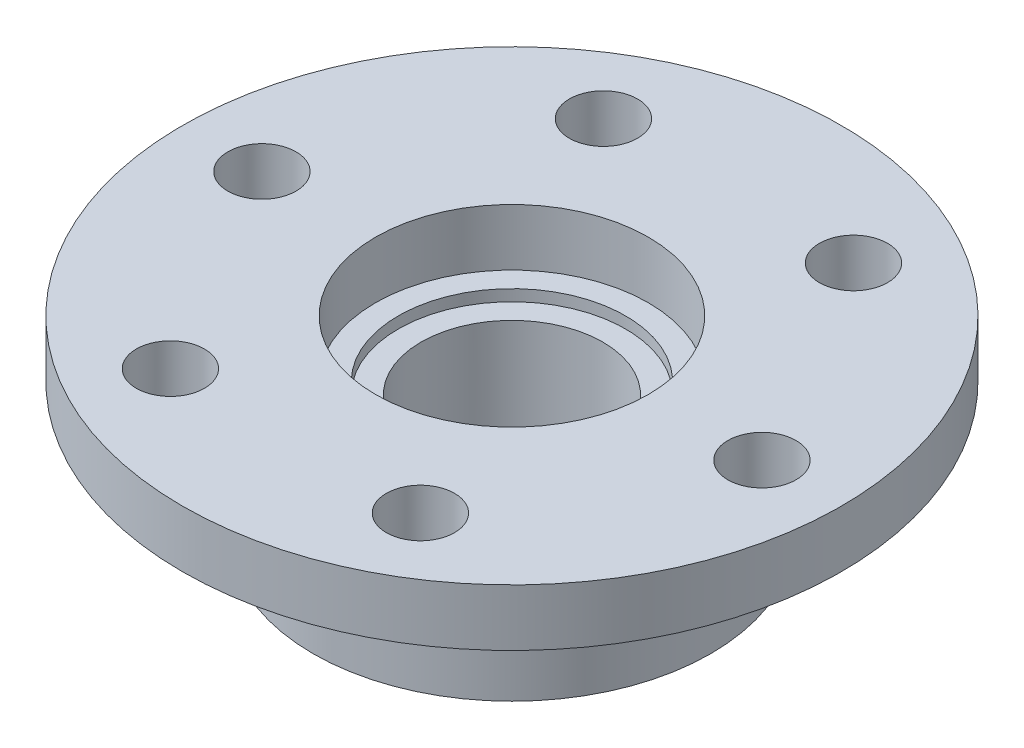
ISO-10303-21;
HEADER;
FILE_DESCRIPTION(('STEP AP214'),'2;1');
FILE_NAME('part.step','',(''),(''),'','','');
FILE_SCHEMA(('AUTOMOTIVE_DESIGN { 1 0 10303 214 1 1 1 1 }'));
ENDSEC;
DATA;
#1=APPLICATION_CONTEXT('core data for automotive mechanical design processes');
#2=APPLICATION_PROTOCOL_DEFINITION('international standard','automotive_design',2000,#1);
#3=PRODUCT_CONTEXT('',#1,'mechanical');
#4=PRODUCT('Part','Part','',(#3));
#5=PRODUCT_RELATED_PRODUCT_CATEGORY('part','',(#4));
#6=PRODUCT_DEFINITION_FORMATION('','',#4);
#7=PRODUCT_DEFINITION_CONTEXT('part definition',#1,'design');
#8=PRODUCT_DEFINITION('design','',#6,#7);
#9=PRODUCT_DEFINITION_SHAPE('','',#8);
#10=(LENGTH_UNIT() NAMED_UNIT(*) SI_UNIT(.MILLI.,.METRE.));
#11=(NAMED_UNIT(*) PLANE_ANGLE_UNIT() SI_UNIT($,.RADIAN.));
#12=(NAMED_UNIT(*) SI_UNIT($,.STERADIAN.) SOLID_ANGLE_UNIT());
#13=UNCERTAINTY_MEASURE_WITH_UNIT(LENGTH_MEASURE(1.E-05),#10,'distance_accuracy_value','');
#14=(GEOMETRIC_REPRESENTATION_CONTEXT(3) GLOBAL_UNCERTAINTY_ASSIGNED_CONTEXT((#13)) GLOBAL_UNIT_ASSIGNED_CONTEXT((#10,
#11,#12)) REPRESENTATION_CONTEXT('',''));
#15=CARTESIAN_POINT('',(0.,0.,0.));
#16=DIRECTION('',(0.,0.,1.));
#17=DIRECTION('',(1.,0.,0.));
#18=AXIS2_PLACEMENT_3D('',#15,#16,#17);
#19=CARTESIAN_POINT('',(0.,12.,0.));
#20=DIRECTION('',(0.,1.,0.));
#21=DIRECTION('',(0.,0.,1.));
#22=AXIS2_PLACEMENT_3D('',#19,#20,#21);
#23=PLANE('',#22);
#24=CARTESIAN_POINT('',(0.,12.,0.));
#25=DIRECTION('',(0.,1.,0.));
#26=DIRECTION('',(0.,0.,1.));
#27=AXIS2_PLACEMENT_3D('',#24,#25,#26);
#28=CIRCLE('',#27,29.);
#29=CARTESIAN_POINT('',(0.,12.,29.));
#30=VERTEX_POINT('',#29);
#31=EDGE_CURVE('E49',#30,#30,#28,.T.);
#32=ORIENTED_EDGE('',*,*,#31,.F.);
#33=EDGE_LOOP('',(#32));
#34=FACE_BOUND('',#33,.T.);
#35=CARTESIAN_POINT('',(11.,12.,-19.0525588832576));
#36=DIRECTION('',(0.,-1.,0.));
#37=DIRECTION('',(0.,0.,-1.));
#38=AXIS2_PLACEMENT_3D('',#35,#36,#37);
#39=CIRCLE('',#38,3.);
#40=CARTESIAN_POINT('',(11.,12.,-22.0525588832576));
#41=VERTEX_POINT('',#40);
#42=EDGE_CURVE('E89',#41,#41,#39,.T.);
#43=ORIENTED_EDGE('',*,*,#42,.F.);
#44=EDGE_LOOP('',(#43));
#45=FACE_BOUND('',#44,.T.);
#46=CARTESIAN_POINT('',(-11.,12.,-19.0525588832577));
#47=DIRECTION('',(0.,-1.,0.));
#48=DIRECTION('',(0.,0.,-1.));
#49=AXIS2_PLACEMENT_3D('',#46,#47,#48);
#50=CIRCLE('',#49,3.);
#51=CARTESIAN_POINT('',(-11.,12.,-22.0525588832576));
#52=VERTEX_POINT('',#51);
#53=EDGE_CURVE('E83',#52,#52,#50,.T.);
#54=ORIENTED_EDGE('',*,*,#53,.F.);
#55=EDGE_LOOP('',(#54));
#56=FACE_BOUND('',#55,.T.);
#57=CARTESIAN_POINT('',(-22.,12.,0.));
#58=DIRECTION('',(0.,-1.,0.));
#59=DIRECTION('',(0.,0.,-1.));
#60=AXIS2_PLACEMENT_3D('',#57,#58,#59);
#61=CIRCLE('',#60,3.);
#62=CARTESIAN_POINT('',(-22.,12.,-3.));
#63=VERTEX_POINT('',#62);
#64=EDGE_CURVE('E77',#63,#63,#61,.T.);
#65=ORIENTED_EDGE('',*,*,#64,.F.);
#66=EDGE_LOOP('',(#65));
#67=FACE_BOUND('',#66,.T.);
#68=CARTESIAN_POINT('',(-11.,12.,19.0525588832576));
#69=DIRECTION('',(0.,-1.,0.));
#70=DIRECTION('',(0.,0.,-1.));
#71=AXIS2_PLACEMENT_3D('',#68,#69,#70);
#72=CIRCLE('',#71,3.);
#73=CARTESIAN_POINT('',(-11.,12.,16.0525588832576));
#74=VERTEX_POINT('',#73);
#75=EDGE_CURVE('E70',#74,#74,#72,.T.);
#76=ORIENTED_EDGE('',*,*,#75,.F.);
#77=EDGE_LOOP('',(#76));
#78=FACE_BOUND('',#77,.T.);
#79=CARTESIAN_POINT('',(11.,12.,19.0525588832577));
#80=DIRECTION('',(0.,-1.,0.));
#81=DIRECTION('',(0.,0.,-1.));
#82=AXIS2_PLACEMENT_3D('',#79,#80,#81);
#83=CIRCLE('',#82,3.);
#84=CARTESIAN_POINT('',(11.,12.,16.0525588832577));
#85=VERTEX_POINT('',#84);
#86=EDGE_CURVE('E71',#85,#85,#83,.T.);
#87=ORIENTED_EDGE('',*,*,#86,.F.);
#88=EDGE_LOOP('',(#87));
#89=FACE_BOUND('',#88,.T.);
#90=CARTESIAN_POINT('',(22.,12.,0.));
#91=DIRECTION('',(0.,-1.,0.));
#92=DIRECTION('',(0.,0.,-1.));
#93=AXIS2_PLACEMENT_3D('',#90,#91,#92);
#94=CIRCLE('',#93,2.99999999999999);
#95=CARTESIAN_POINT('',(22.,12.,-2.99999999999999));
#96=VERTEX_POINT('',#95);
#97=EDGE_CURVE('E64',#96,#96,#94,.T.);
#98=ORIENTED_EDGE('',*,*,#97,.F.);
#99=EDGE_LOOP('',(#98));
#100=FACE_BOUND('',#99,.T.);
#101=CARTESIAN_POINT('',(0.,12.,0.));
#102=DIRECTION('',(0.,1.,0.));
#103=DIRECTION('',(0.,0.,1.));
#104=AXIS2_PLACEMENT_3D('',#101,#102,#103);
#105=CIRCLE('',#104,18.8);
#106=CARTESIAN_POINT('',(0.,12.,18.8));
#107=VERTEX_POINT('',#106);
#108=EDGE_CURVE('E10',#107,#107,#105,.F.);
#109=ORIENTED_EDGE('',*,*,#108,.F.);
#110=EDGE_LOOP('',(#109));
#111=FACE_BOUND('',#110,.T.);
#112=ADVANCED_FACE('F34',(#34,#45,#56,#67,#78,#89,#100,#111),#23,.F.);
#113=CARTESIAN_POINT('',(0.,17.,0.));
#114=DIRECTION('',(0.,-1.,0.));
#115=DIRECTION('',(0.,0.,-1.));
#116=AXIS2_PLACEMENT_3D('',#113,#114,#115);
#117=CYLINDRICAL_SURFACE('',#116,29.);
#118=CARTESIAN_POINT('',(0.,17.,0.));
#119=DIRECTION('',(0.,1.,0.));
#120=DIRECTION('',(0.,0.,1.));
#121=AXIS2_PLACEMENT_3D('',#118,#119,#120);
#122=CIRCLE('',#121,29.);
#123=CARTESIAN_POINT('',(0.,17.,29.));
#124=VERTEX_POINT('',#123);
#125=EDGE_CURVE('E45',#124,#124,#122,.T.);
#126=ORIENTED_EDGE('',*,*,#125,.F.);
#127=EDGE_LOOP('',(#126));
#128=FACE_BOUND('',#127,.T.);
#129=ORIENTED_EDGE('',*,*,#31,.T.);
#130=EDGE_LOOP('',(#129));
#131=FACE_BOUND('',#130,.T.);
#132=ADVANCED_FACE('F194',(#128,#131),#117,.T.);
#133=CARTESIAN_POINT('',(0.,17.,0.));
#134=DIRECTION('',(0.,1.,0.));
#135=DIRECTION('',(0.,0.,1.));
#136=AXIS2_PLACEMENT_3D('',#133,#134,#135);
#137=PLANE('',#136);
#138=CARTESIAN_POINT('',(22.,17.,0.));
#139=DIRECTION('',(0.,1.,0.));
#140=DIRECTION('',(0.,0.,1.));
#141=AXIS2_PLACEMENT_3D('',#138,#139,#140);
#142=CIRCLE('',#141,2.99999999999999);
#143=CARTESIAN_POINT('',(22.,17.,2.99999999999999));
#144=VERTEX_POINT('',#143);
#145=EDGE_CURVE('E92',#144,#144,#142,.F.);
#146=ORIENTED_EDGE('',*,*,#145,.T.);
#147=EDGE_LOOP('',(#146));
#148=FACE_BOUND('',#147,.T.);
#149=CARTESIAN_POINT('',(11.,17.,19.0525588832577));
#150=DIRECTION('',(0.,1.,0.));
#151=DIRECTION('',(0.,0.,1.));
#152=AXIS2_PLACEMENT_3D('',#149,#150,#151);
#153=CIRCLE('',#152,3.);
#154=CARTESIAN_POINT('',(11.,17.,22.0525588832577));
#155=VERTEX_POINT('',#154);
#156=EDGE_CURVE('E93',#155,#155,#153,.F.);
#157=ORIENTED_EDGE('',*,*,#156,.T.);
#158=EDGE_LOOP('',(#157));
#159=FACE_BOUND('',#158,.T.);
#160=CARTESIAN_POINT('',(-11.,17.,19.0525588832576));
#161=DIRECTION('',(0.,1.,0.));
#162=DIRECTION('',(0.,0.,1.));
#163=AXIS2_PLACEMENT_3D('',#160,#161,#162);
#164=CIRCLE('',#163,3.);
#165=CARTESIAN_POINT('',(-11.,17.,22.0525588832576));
#166=VERTEX_POINT('',#165);
#167=EDGE_CURVE('E67',#166,#166,#164,.F.);
#168=ORIENTED_EDGE('',*,*,#167,.T.);
#169=EDGE_LOOP('',(#168));
#170=FACE_BOUND('',#169,.T.);
#171=CARTESIAN_POINT('',(-22.,17.,0.));
#172=DIRECTION('',(0.,1.,0.));
#173=DIRECTION('',(0.,0.,1.));
#174=AXIS2_PLACEMENT_3D('',#171,#172,#173);
#175=CIRCLE('',#174,3.);
#176=CARTESIAN_POINT('',(-22.,17.,3.));
#177=VERTEX_POINT('',#176);
#178=EDGE_CURVE('E74',#177,#177,#175,.F.);
#179=ORIENTED_EDGE('',*,*,#178,.T.);
#180=EDGE_LOOP('',(#179));
#181=FACE_BOUND('',#180,.T.);
#182=CARTESIAN_POINT('',(-11.,17.,-19.0525588832577));
#183=DIRECTION('',(0.,1.,0.));
#184=DIRECTION('',(0.,0.,1.));
#185=AXIS2_PLACEMENT_3D('',#182,#183,#184);
#186=CIRCLE('',#185,3.);
#187=CARTESIAN_POINT('',(-11.,17.,-16.0525588832577));
#188=VERTEX_POINT('',#187);
#189=EDGE_CURVE('E80',#188,#188,#186,.F.);
#190=ORIENTED_EDGE('',*,*,#189,.T.);
#191=EDGE_LOOP('',(#190));
#192=FACE_BOUND('',#191,.T.);
#193=CARTESIAN_POINT('',(11.,17.,-19.0525588832576));
#194=DIRECTION('',(0.,1.,0.));
#195=DIRECTION('',(0.,0.,1.));
#196=AXIS2_PLACEMENT_3D('',#193,#194,#195);
#197=CIRCLE('',#196,3.);
#198=CARTESIAN_POINT('',(11.,17.,-16.0525588832576));
#199=VERTEX_POINT('',#198);
#200=EDGE_CURVE('E86',#199,#199,#197,.F.);
#201=ORIENTED_EDGE('',*,*,#200,.T.);
#202=EDGE_LOOP('',(#201));
#203=FACE_BOUND('',#202,.T.);
#204=CARTESIAN_POINT('',(0.,17.,0.));
#205=DIRECTION('',(0.,1.,0.));
#206=DIRECTION('',(0.,0.,1.));
#207=AXIS2_PLACEMENT_3D('',#204,#205,#206);
#208=CIRCLE('',#207,12.);
#209=CARTESIAN_POINT('',(0.,17.,12.));
#210=VERTEX_POINT('',#209);
#211=EDGE_CURVE('E55',#210,#210,#208,.T.);
#212=ORIENTED_EDGE('',*,*,#211,.F.);
#213=EDGE_LOOP('',(#212));
#214=FACE_BOUND('',#213,.T.);
#215=ORIENTED_EDGE('',*,*,#125,.T.);
#216=EDGE_LOOP('',(#215));
#217=FACE_BOUND('',#216,.T.);
#218=ADVANCED_FACE('F200',(#148,#159,#170,#181,#192,#203,#214,#217),#137,.T.);
#219=CARTESIAN_POINT('',(0.,12.,0.));
#220=DIRECTION('',(0.,1.,0.));
#221=DIRECTION('',(0.,0.,1.));
#222=AXIS2_PLACEMENT_3D('',#219,#220,#221);
#223=CYLINDRICAL_SURFACE('',#222,12.);
#224=CARTESIAN_POINT('',(0.,12.,0.));
#225=DIRECTION('',(0.,1.,0.));
#226=DIRECTION('',(0.,0.,1.));
#227=AXIS2_PLACEMENT_3D('',#224,#225,#226);
#228=CIRCLE('',#227,12.);
#229=CARTESIAN_POINT('',(0.,12.,12.));
#230=VERTEX_POINT('',#229);
#231=EDGE_CURVE('E53',#230,#230,#228,.T.);
#232=ORIENTED_EDGE('',*,*,#231,.F.);
#233=EDGE_LOOP('',(#232));
#234=FACE_BOUND('',#233,.T.);
#235=ORIENTED_EDGE('',*,*,#211,.T.);
#236=EDGE_LOOP('',(#235));
#237=FACE_BOUND('',#236,.T.);
#238=ADVANCED_FACE('F208',(#234,#237),#223,.F.);
#239=CARTESIAN_POINT('',(0.,12.,0.));
#240=DIRECTION('',(0.,1.,0.));
#241=DIRECTION('',(0.,0.,1.));
#242=AXIS2_PLACEMENT_3D('',#239,#240,#241);
#243=PLANE('',#242);
#244=CARTESIAN_POINT('',(0.,12.,0.));
#245=DIRECTION('',(0.,1.,0.));
#246=DIRECTION('',(0.,0.,1.));
#247=AXIS2_PLACEMENT_3D('',#244,#245,#246);
#248=CIRCLE('',#247,10.);
#249=CARTESIAN_POINT('',(0.,12.,10.));
#250=VERTEX_POINT('',#249);
#251=EDGE_CURVE('E61',#250,#250,#248,.T.);
#252=ORIENTED_EDGE('',*,*,#251,.F.);
#253=EDGE_LOOP('',(#252));
#254=FACE_BOUND('',#253,.T.);
#255=ORIENTED_EDGE('',*,*,#231,.T.);
#256=EDGE_LOOP('',(#255));
#257=FACE_BOUND('',#256,.T.);
#258=ADVANCED_FACE('F212',(#254,#257),#243,.T.);
#259=CARTESIAN_POINT('',(0.,11.,0.));
#260=DIRECTION('',(0.,1.,0.));
#261=DIRECTION('',(0.,0.,1.));
#262=AXIS2_PLACEMENT_3D('',#259,#260,#261);
#263=CYLINDRICAL_SURFACE('',#262,10.);
#264=CARTESIAN_POINT('',(0.,11.,0.));
#265=DIRECTION('',(0.,1.,0.));
#266=DIRECTION('',(0.,0.,1.));
#267=AXIS2_PLACEMENT_3D('',#264,#265,#266);
#268=CIRCLE('',#267,10.);
#269=CARTESIAN_POINT('',(0.,11.,10.));
#270=VERTEX_POINT('',#269);
#271=EDGE_CURVE('E58',#270,#270,#268,.T.);
#272=ORIENTED_EDGE('',*,*,#271,.F.);
#273=EDGE_LOOP('',(#272));
#274=FACE_BOUND('',#273,.T.);
#275=ORIENTED_EDGE('',*,*,#251,.T.);
#276=EDGE_LOOP('',(#275));
#277=FACE_BOUND('',#276,.T.);
#278=ADVANCED_FACE('F216',(#274,#277),#263,.F.);
#279=CARTESIAN_POINT('',(0.,11.,0.));
#280=DIRECTION('',(0.,1.,0.));
#281=DIRECTION('',(0.,0.,1.));
#282=AXIS2_PLACEMENT_3D('',#279,#280,#281);
#283=PLANE('',#282);
#284=CARTESIAN_POINT('',(0.,11.,0.));
#285=DIRECTION('',(0.,1.,0.));
#286=DIRECTION('',(0.,0.,1.));
#287=AXIS2_PLACEMENT_3D('',#284,#285,#286);
#288=CIRCLE('',#287,8.);
#289=CARTESIAN_POINT('',(0.,11.,8.));
#290=VERTEX_POINT('',#289);
#291=EDGE_CURVE('E109',#290,#290,#288,.F.);
#292=ORIENTED_EDGE('',*,*,#291,.T.);
#293=EDGE_LOOP('',(#292));
#294=FACE_BOUND('',#293,.T.);
#295=ORIENTED_EDGE('',*,*,#271,.T.);
#296=EDGE_LOOP('',(#295));
#297=FACE_BOUND('',#296,.T.);
#298=ADVANCED_FACE('F220',(#294,#297),#283,.T.);
#299=CARTESIAN_POINT('',(11.,17.001,-19.0525588832576));
#300=DIRECTION('',(0.,-1.,0.));
#301=DIRECTION('',(0.,0.,-1.));
#302=AXIS2_PLACEMENT_3D('',#299,#300,#301);
#303=CYLINDRICAL_SURFACE('',#302,3.);
#304=ORIENTED_EDGE('',*,*,#200,.F.);
#305=EDGE_LOOP('',(#304));
#306=FACE_BOUND('',#305,.T.);
#307=ORIENTED_EDGE('',*,*,#42,.T.);
#308=EDGE_LOOP('',(#307));
#309=FACE_BOUND('',#308,.T.);
#310=ADVANCED_FACE('F224',(#306,#309),#303,.F.);
#311=CARTESIAN_POINT('',(-11.,17.001,-19.0525588832577));
#312=DIRECTION('',(0.,-1.,0.));
#313=DIRECTION('',(0.,0.,-1.));
#314=AXIS2_PLACEMENT_3D('',#311,#312,#313);
#315=CYLINDRICAL_SURFACE('',#314,3.);
#316=ORIENTED_EDGE('',*,*,#189,.F.);
#317=EDGE_LOOP('',(#316));
#318=FACE_BOUND('',#317,.T.);
#319=ORIENTED_EDGE('',*,*,#53,.T.);
#320=EDGE_LOOP('',(#319));
#321=FACE_BOUND('',#320,.T.);
#322=ADVANCED_FACE('F234',(#318,#321),#315,.F.);
#323=CARTESIAN_POINT('',(-22.,17.001,0.));
#324=DIRECTION('',(0.,-1.,0.));
#325=DIRECTION('',(0.,0.,-1.));
#326=AXIS2_PLACEMENT_3D('',#323,#324,#325);
#327=CYLINDRICAL_SURFACE('',#326,3.);
#328=ORIENTED_EDGE('',*,*,#178,.F.);
#329=EDGE_LOOP('',(#328));
#330=FACE_BOUND('',#329,.T.);
#331=ORIENTED_EDGE('',*,*,#64,.T.);
#332=EDGE_LOOP('',(#331));
#333=FACE_BOUND('',#332,.T.);
#334=ADVANCED_FACE('F230',(#330,#333),#327,.F.);
#335=CARTESIAN_POINT('',(-11.,17.001,19.0525588832576));
#336=DIRECTION('',(0.,-1.,0.));
#337=DIRECTION('',(0.,0.,-1.));
#338=AXIS2_PLACEMENT_3D('',#335,#336,#337);
#339=CYLINDRICAL_SURFACE('',#338,3.);
#340=ORIENTED_EDGE('',*,*,#167,.F.);
#341=EDGE_LOOP('',(#340));
#342=FACE_BOUND('',#341,.T.);
#343=ORIENTED_EDGE('',*,*,#75,.T.);
#344=EDGE_LOOP('',(#343));
#345=FACE_BOUND('',#344,.T.);
#346=ADVANCED_FACE('F226',(#342,#345),#339,.F.);
#347=CARTESIAN_POINT('',(11.,17.001,19.0525588832577));
#348=DIRECTION('',(0.,-1.,0.));
#349=DIRECTION('',(0.,0.,-1.));
#350=AXIS2_PLACEMENT_3D('',#347,#348,#349);
#351=CYLINDRICAL_SURFACE('',#350,3.);
#352=ORIENTED_EDGE('',*,*,#156,.F.);
#353=EDGE_LOOP('',(#352));
#354=FACE_BOUND('',#353,.T.);
#355=ORIENTED_EDGE('',*,*,#86,.T.);
#356=EDGE_LOOP('',(#355));
#357=FACE_BOUND('',#356,.T.);
#358=ADVANCED_FACE('F229',(#354,#357),#351,.F.);
#359=CARTESIAN_POINT('',(22.,17.001,0.));
#360=DIRECTION('',(0.,-1.,0.));
#361=DIRECTION('',(0.,0.,-1.));
#362=AXIS2_PLACEMENT_3D('',#359,#360,#361);
#363=CYLINDRICAL_SURFACE('',#362,2.99999999999999);
#364=ORIENTED_EDGE('',*,*,#145,.F.);
#365=EDGE_LOOP('',(#364));
#366=FACE_BOUND('',#365,.T.);
#367=ORIENTED_EDGE('',*,*,#97,.T.);
#368=EDGE_LOOP('',(#367));
#369=FACE_BOUND('',#368,.T.);
#370=ADVANCED_FACE('F244',(#366,#369),#363,.F.);
#371=CARTESIAN_POINT('',(0.,11.1,0.));
#372=DIRECTION('',(0.,-1.,0.));
#373=DIRECTION('',(0.,0.,-1.));
#374=AXIS2_PLACEMENT_3D('',#371,#372,#373);
#375=PLANE('',#374);
#376=CARTESIAN_POINT('',(0.,11.1,0.));
#377=DIRECTION('',(0.,-1.,0.));
#378=DIRECTION('',(0.,0.,-1.));
#379=AXIS2_PLACEMENT_3D('',#376,#377,#378);
#380=CIRCLE('',#379,18.8);
#381=CARTESIAN_POINT('',(0.,11.1,-18.8));
#382=VERTEX_POINT('',#381);
#383=EDGE_CURVE('E96',#382,#382,#380,.T.);
#384=ORIENTED_EDGE('',*,*,#383,.T.);
#385=EDGE_LOOP('',(#384));
#386=FACE_BOUND('',#385,.T.);
#387=CARTESIAN_POINT('',(0.,11.1,0.));
#388=DIRECTION('',(0.,-1.,0.));
#389=DIRECTION('',(0.,0.,-1.));
#390=AXIS2_PLACEMENT_3D('',#387,#388,#389);
#391=CIRCLE('',#390,17.5);
#392=CARTESIAN_POINT('',(0.,11.1,-17.5));
#393=VERTEX_POINT('',#392);
#394=EDGE_CURVE('E105',#393,#393,#391,.T.);
#395=ORIENTED_EDGE('',*,*,#394,.F.);
#396=EDGE_LOOP('',(#395));
#397=FACE_BOUND('',#396,.T.);
#398=ADVANCED_FACE('F248',(#386,#397),#375,.T.);
#399=CARTESIAN_POINT('',(0.,11.1,0.));
#400=DIRECTION('',(0.,1.,0.));
#401=DIRECTION('',(0.,0.,1.));
#402=AXIS2_PLACEMENT_3D('',#399,#400,#401);
#403=CYLINDRICAL_SURFACE('',#402,18.8);
#404=ORIENTED_EDGE('',*,*,#383,.F.);
#405=EDGE_LOOP('',(#404));
#406=FACE_BOUND('',#405,.T.);
#407=ORIENTED_EDGE('',*,*,#108,.T.);
#408=EDGE_LOOP('',(#407));
#409=FACE_BOUND('',#408,.T.);
#410=ADVANCED_FACE('F163',(#406,#409),#403,.T.);
#411=CARTESIAN_POINT('',(0.,0.,0.));
#412=DIRECTION('',(0.,1.,0.));
#413=DIRECTION('',(0.,0.,1.));
#414=AXIS2_PLACEMENT_3D('',#411,#412,#413);
#415=PLANE('',#414);
#416=CARTESIAN_POINT('',(0.,0.,12.75));
#417=DIRECTION('',(0.,-1.,0.));
#418=DIRECTION('',(0.,0.,-1.));
#419=AXIS2_PLACEMENT_3D('',#416,#417,#418);
#420=CIRCLE('',#419,2.7);
#421=CARTESIAN_POINT('',(0.,0.,10.05));
#422=VERTEX_POINT('',#421);
#423=EDGE_CURVE('E140',#422,#422,#420,.T.);
#424=ORIENTED_EDGE('',*,*,#423,.F.);
#425=EDGE_LOOP('',(#424));
#426=FACE_BOUND('',#425,.T.);
#427=CARTESIAN_POINT('',(-11.0418238982516,0.,6.37499999999999));
#428=DIRECTION('',(0.,-1.,0.));
#429=DIRECTION('',(0.,0.,-1.));
#430=AXIS2_PLACEMENT_3D('',#427,#428,#429);
#431=CIRCLE('',#430,2.7);
#432=CARTESIAN_POINT('',(-11.0418238982516,0.,3.67499999999999));
#433=VERTEX_POINT('',#432);
#434=EDGE_CURVE('E141',#433,#433,#431,.T.);
#435=ORIENTED_EDGE('',*,*,#434,.F.);
#436=EDGE_LOOP('',(#435));
#437=FACE_BOUND('',#436,.T.);
#438=CARTESIAN_POINT('',(-11.0418238982516,0.,-6.37500000000001));
#439=DIRECTION('',(0.,-1.,0.));
#440=DIRECTION('',(0.,0.,-1.));
#441=AXIS2_PLACEMENT_3D('',#438,#439,#440);
#442=CIRCLE('',#441,2.7);
#443=CARTESIAN_POINT('',(-11.0418238982516,0.,-9.07500000000001));
#444=VERTEX_POINT('',#443);
#445=EDGE_CURVE('E115',#444,#444,#442,.T.);
#446=ORIENTED_EDGE('',*,*,#445,.F.);
#447=EDGE_LOOP('',(#446));
#448=FACE_BOUND('',#447,.T.);
#449=CARTESIAN_POINT('',(0.,0.,-12.75));
#450=DIRECTION('',(0.,-1.,0.));
#451=DIRECTION('',(0.,0.,-1.));
#452=AXIS2_PLACEMENT_3D('',#449,#450,#451);
#453=CIRCLE('',#452,2.7);
#454=CARTESIAN_POINT('',(0.,0.,-15.45));
#455=VERTEX_POINT('',#454);
#456=EDGE_CURVE('E122',#455,#455,#453,.T.);
#457=ORIENTED_EDGE('',*,*,#456,.F.);
#458=EDGE_LOOP('',(#457));
#459=FACE_BOUND('',#458,.T.);
#460=CARTESIAN_POINT('',(11.0418238982516,0.,-6.375));
#461=DIRECTION('',(0.,-1.,0.));
#462=DIRECTION('',(0.,0.,-1.));
#463=AXIS2_PLACEMENT_3D('',#460,#461,#462);
#464=CIRCLE('',#463,2.7);
#465=CARTESIAN_POINT('',(11.0418238982516,0.,-9.075));
#466=VERTEX_POINT('',#465);
#467=EDGE_CURVE('E128',#466,#466,#464,.T.);
#468=ORIENTED_EDGE('',*,*,#467,.F.);
#469=EDGE_LOOP('',(#468));
#470=FACE_BOUND('',#469,.T.);
#471=CARTESIAN_POINT('',(11.0418238982516,0.,6.375));
#472=DIRECTION('',(0.,-1.,0.));
#473=DIRECTION('',(0.,0.,-1.));
#474=AXIS2_PLACEMENT_3D('',#471,#472,#473);
#475=CIRCLE('',#474,2.7);
#476=CARTESIAN_POINT('',(11.0418238982516,0.,3.675));
#477=VERTEX_POINT('',#476);
#478=EDGE_CURVE('E134',#477,#477,#475,.T.);
#479=ORIENTED_EDGE('',*,*,#478,.F.);
#480=EDGE_LOOP('',(#479));
#481=FACE_BOUND('',#480,.T.);
#482=CARTESIAN_POINT('',(0.,0.,0.));
#483=DIRECTION('',(0.,-1.,0.));
#484=DIRECTION('',(0.,0.,-1.));
#485=AXIS2_PLACEMENT_3D('',#482,#483,#484);
#486=CIRCLE('',#485,8.);
#487=CARTESIAN_POINT('',(0.,0.,-8.));
#488=VERTEX_POINT('',#487);
#489=EDGE_CURVE('E108',#488,#488,#486,.T.);
#490=ORIENTED_EDGE('',*,*,#489,.F.);
#491=EDGE_LOOP('',(#490));
#492=FACE_BOUND('',#491,.T.);
#493=CARTESIAN_POINT('',(0.,0.,0.));
#494=DIRECTION('',(0.,1.,0.));
#495=DIRECTION('',(0.,0.,1.));
#496=AXIS2_PLACEMENT_3D('',#493,#494,#495);
#497=CIRCLE('',#496,17.5);
#498=CARTESIAN_POINT('',(0.,0.,17.5));
#499=VERTEX_POINT('',#498);
#500=EDGE_CURVE('E41',#499,#499,#497,.T.);
#501=ORIENTED_EDGE('',*,*,#500,.F.);
#502=EDGE_LOOP('',(#501));
#503=FACE_BOUND('',#502,.T.);
#504=ADVANCED_FACE('F160',(#426,#437,#448,#459,#470,#481,#492,#503),#415,.F.);
#505=CARTESIAN_POINT('',(0.,12.,0.));
#506=DIRECTION('',(0.,-1.,0.));
#507=DIRECTION('',(0.,0.,-1.));
#508=AXIS2_PLACEMENT_3D('',#505,#506,#507);
#509=CYLINDRICAL_SURFACE('',#508,17.5);
#510=ORIENTED_EDGE('',*,*,#394,.T.);
#511=EDGE_LOOP('',(#510));
#512=FACE_BOUND('',#511,.T.);
#513=ORIENTED_EDGE('',*,*,#500,.T.);
#514=EDGE_LOOP('',(#513));
#515=FACE_BOUND('',#514,.T.);
#516=ADVANCED_FACE('F36',(#512,#515),#509,.T.);
#517=CARTESIAN_POINT('',(0.,17.001,0.));
#518=DIRECTION('',(0.,-1.,0.));
#519=DIRECTION('',(0.,0.,-1.));
#520=AXIS2_PLACEMENT_3D('',#517,#518,#519);
#521=CYLINDRICAL_SURFACE('',#520,8.);
#522=ORIENTED_EDGE('',*,*,#291,.F.);
#523=EDGE_LOOP('',(#522));
#524=FACE_BOUND('',#523,.T.);
#525=ORIENTED_EDGE('',*,*,#489,.T.);
#526=EDGE_LOOP('',(#525));
#527=FACE_BOUND('',#526,.T.);
#528=ADVANCED_FACE('F177',(#524,#527),#521,.F.);
#529=CARTESIAN_POINT('',(11.0418238982516,10.,6.375));
#530=DIRECTION('',(0.,-1.,0.));
#531=DIRECTION('',(0.,0.,-1.));
#532=AXIS2_PLACEMENT_3D('',#529,#530,#531);
#533=CYLINDRICAL_SURFACE('',#532,2.7);
#534=CARTESIAN_POINT('',(11.0418238982516,10.,6.375));
#535=DIRECTION('',(0.,-1.,0.));
#536=DIRECTION('',(0.,0.,-1.));
#537=AXIS2_PLACEMENT_3D('',#534,#535,#536);
#538=CIRCLE('',#537,2.7);
#539=CARTESIAN_POINT('',(11.0418238982516,10.,3.675));
#540=VERTEX_POINT('',#539);
#541=EDGE_CURVE('E137',#540,#540,#538,.T.);
#542=ORIENTED_EDGE('',*,*,#541,.F.);
#543=EDGE_LOOP('',(#542));
#544=FACE_BOUND('',#543,.T.);
#545=ORIENTED_EDGE('',*,*,#478,.T.);
#546=EDGE_LOOP('',(#545));
#547=FACE_BOUND('',#546,.T.);
#548=ADVANCED_FACE('F179',(#544,#547),#533,.F.);
#549=CARTESIAN_POINT('',(11.0418238982516,10.,6.375));
#550=DIRECTION('',(0.,-1.,0.));
#551=DIRECTION('',(0.,0.,-1.));
#552=AXIS2_PLACEMENT_3D('',#549,#550,#551);
#553=PLANE('',#552);
#554=ORIENTED_EDGE('',*,*,#541,.T.);
#555=EDGE_LOOP('',(#554));
#556=FACE_BOUND('',#555,.T.);
#557=ADVANCED_FACE('F186',(#556),#553,.T.);
#558=CARTESIAN_POINT('',(11.0418238982516,10.,-6.375));
#559=DIRECTION('',(0.,-1.,0.));
#560=DIRECTION('',(0.,0.,-1.));
#561=AXIS2_PLACEMENT_3D('',#558,#559,#560);
#562=CYLINDRICAL_SURFACE('',#561,2.7);
#563=CARTESIAN_POINT('',(11.0418238982516,10.,-6.375));
#564=DIRECTION('',(0.,-1.,0.));
#565=DIRECTION('',(0.,0.,-1.));
#566=AXIS2_PLACEMENT_3D('',#563,#564,#565);
#567=CIRCLE('',#566,2.7);
#568=CARTESIAN_POINT('',(11.0418238982516,10.,-9.075));
#569=VERTEX_POINT('',#568);
#570=EDGE_CURVE('E131',#569,#569,#567,.T.);
#571=ORIENTED_EDGE('',*,*,#570,.F.);
#572=EDGE_LOOP('',(#571));
#573=FACE_BOUND('',#572,.T.);
#574=ORIENTED_EDGE('',*,*,#467,.T.);
#575=EDGE_LOOP('',(#574));
#576=FACE_BOUND('',#575,.T.);
#577=ADVANCED_FACE('F302',(#573,#576),#562,.F.);
#578=CARTESIAN_POINT('',(11.0418238982516,10.,-6.375));
#579=DIRECTION('',(0.,-1.,0.));
#580=DIRECTION('',(0.,0.,-1.));
#581=AXIS2_PLACEMENT_3D('',#578,#579,#580);
#582=PLANE('',#581);
#583=ORIENTED_EDGE('',*,*,#570,.T.);
#584=EDGE_LOOP('',(#583));
#585=FACE_BOUND('',#584,.T.);
#586=ADVANCED_FACE('F311',(#585),#582,.T.);
#587=CARTESIAN_POINT('',(0.,10.,-12.75));
#588=DIRECTION('',(0.,-1.,0.));
#589=DIRECTION('',(0.,0.,-1.));
#590=AXIS2_PLACEMENT_3D('',#587,#588,#589);
#591=CYLINDRICAL_SURFACE('',#590,2.7);
#592=CARTESIAN_POINT('',(0.,10.,-12.75));
#593=DIRECTION('',(0.,-1.,0.));
#594=DIRECTION('',(0.,0.,-1.));
#595=AXIS2_PLACEMENT_3D('',#592,#593,#594);
#596=CIRCLE('',#595,2.7);
#597=CARTESIAN_POINT('',(0.,10.,-15.45));
#598=VERTEX_POINT('',#597);
#599=EDGE_CURVE('E125',#598,#598,#596,.T.);
#600=ORIENTED_EDGE('',*,*,#599,.F.);
#601=EDGE_LOOP('',(#600));
#602=FACE_BOUND('',#601,.T.);
#603=ORIENTED_EDGE('',*,*,#456,.T.);
#604=EDGE_LOOP('',(#603));
#605=FACE_BOUND('',#604,.T.);
#606=ADVANCED_FACE('F320',(#602,#605),#591,.F.);
#607=CARTESIAN_POINT('',(0.,10.,-12.75));
#608=DIRECTION('',(0.,-1.,0.));
#609=DIRECTION('',(0.,0.,-1.));
#610=AXIS2_PLACEMENT_3D('',#607,#608,#609);
#611=PLANE('',#610);
#612=ORIENTED_EDGE('',*,*,#599,.T.);
#613=EDGE_LOOP('',(#612));
#614=FACE_BOUND('',#613,.T.);
#615=ADVANCED_FACE('F329',(#614),#611,.T.);
#616=CARTESIAN_POINT('',(-11.0418238982516,10.,-6.37500000000001));
#617=DIRECTION('',(0.,-1.,0.));
#618=DIRECTION('',(0.,0.,-1.));
#619=AXIS2_PLACEMENT_3D('',#616,#617,#618);
#620=CYLINDRICAL_SURFACE('',#619,2.7);
#621=CARTESIAN_POINT('',(-11.0418238982516,10.,-6.37500000000001));
#622=DIRECTION('',(0.,-1.,0.));
#623=DIRECTION('',(0.,0.,-1.));
#624=AXIS2_PLACEMENT_3D('',#621,#622,#623);
#625=CIRCLE('',#624,2.7);
#626=CARTESIAN_POINT('',(-11.0418238982516,10.,-9.07500000000001));
#627=VERTEX_POINT('',#626);
#628=EDGE_CURVE('E118',#627,#627,#625,.T.);
#629=ORIENTED_EDGE('',*,*,#628,.F.);
#630=EDGE_LOOP('',(#629));
#631=FACE_BOUND('',#630,.T.);
#632=ORIENTED_EDGE('',*,*,#445,.T.);
#633=EDGE_LOOP('',(#632));
#634=FACE_BOUND('',#633,.T.);
#635=ADVANCED_FACE('F338',(#631,#634),#620,.F.);
#636=CARTESIAN_POINT('',(-11.0418238982516,10.,-6.37500000000001));
#637=DIRECTION('',(0.,-1.,0.));
#638=DIRECTION('',(0.,0.,-1.));
#639=AXIS2_PLACEMENT_3D('',#636,#637,#638);
#640=PLANE('',#639);
#641=ORIENTED_EDGE('',*,*,#628,.T.);
#642=EDGE_LOOP('',(#641));
#643=FACE_BOUND('',#642,.T.);
#644=ADVANCED_FACE('F347',(#643),#640,.T.);
#645=CARTESIAN_POINT('',(-11.0418238982516,10.,6.37499999999999));
#646=DIRECTION('',(0.,-1.,0.));
#647=DIRECTION('',(0.,0.,-1.));
#648=AXIS2_PLACEMENT_3D('',#645,#646,#647);
#649=CYLINDRICAL_SURFACE('',#648,2.7);
#650=CARTESIAN_POINT('',(-11.0418238982516,10.,6.37499999999999));
#651=DIRECTION('',(0.,-1.,0.));
#652=DIRECTION('',(0.,0.,-1.));
#653=AXIS2_PLACEMENT_3D('',#650,#651,#652);
#654=CIRCLE('',#653,2.7);
#655=CARTESIAN_POINT('',(-11.0418238982516,10.,3.67499999999999));
#656=VERTEX_POINT('',#655);
#657=EDGE_CURVE('E119',#656,#656,#654,.T.);
#658=ORIENTED_EDGE('',*,*,#657,.F.);
#659=EDGE_LOOP('',(#658));
#660=FACE_BOUND('',#659,.T.);
#661=ORIENTED_EDGE('',*,*,#434,.T.);
#662=EDGE_LOOP('',(#661));
#663=FACE_BOUND('',#662,.T.);
#664=ADVANCED_FACE('F355',(#660,#663),#649,.F.);
#665=CARTESIAN_POINT('',(-11.0418238982516,10.,6.37499999999999));
#666=DIRECTION('',(0.,-1.,0.));
#667=DIRECTION('',(0.,0.,-1.));
#668=AXIS2_PLACEMENT_3D('',#665,#666,#667);
#669=PLANE('',#668);
#670=ORIENTED_EDGE('',*,*,#657,.T.);
#671=EDGE_LOOP('',(#670));
#672=FACE_BOUND('',#671,.T.);
#673=ADVANCED_FACE('F156',(#672),#669,.T.);
#674=CARTESIAN_POINT('',(0.,10.,12.75));
#675=DIRECTION('',(0.,-1.,0.));
#676=DIRECTION('',(0.,0.,-1.));
#677=AXIS2_PLACEMENT_3D('',#674,#675,#676);
#678=CYLINDRICAL_SURFACE('',#677,2.7);
#679=CARTESIAN_POINT('',(0.,10.,12.75));
#680=DIRECTION('',(0.,-1.,0.));
#681=DIRECTION('',(0.,0.,-1.));
#682=AXIS2_PLACEMENT_3D('',#679,#680,#681);
#683=CIRCLE('',#682,2.7);
#684=CARTESIAN_POINT('',(0.,10.,10.05));
#685=VERTEX_POINT('',#684);
#686=EDGE_CURVE('E112',#685,#685,#683,.T.);
#687=ORIENTED_EDGE('',*,*,#686,.F.);
#688=EDGE_LOOP('',(#687));
#689=FACE_BOUND('',#688,.T.);
#690=ORIENTED_EDGE('',*,*,#423,.T.);
#691=EDGE_LOOP('',(#690));
#692=FACE_BOUND('',#691,.T.);
#693=ADVANCED_FACE('F153',(#689,#692),#678,.F.);
#694=CARTESIAN_POINT('',(0.,10.,12.75));
#695=DIRECTION('',(0.,-1.,0.));
#696=DIRECTION('',(0.,0.,-1.));
#697=AXIS2_PLACEMENT_3D('',#694,#695,#696);
#698=PLANE('',#697);
#699=ORIENTED_EDGE('',*,*,#686,.T.);
#700=EDGE_LOOP('',(#699));
#701=FACE_BOUND('',#700,.T.);
#702=ADVANCED_FACE('F151',(#701),#698,.T.);
#703=CLOSED_SHELL('',(#112,#132,#218,#238,#258,#278,#298,#310,#322,#334,#346,#358,#370,#398,
#410,#504,#516,#528,#548,#557,#577,#586,#606,#615,#635,#644,#664,#673,#693,#702));
#704=MANIFOLD_SOLID_BREP('B2',#703);
#705=ADVANCED_BREP_SHAPE_REPRESENTATION('',(#18,#704),#14);
#706=SHAPE_DEFINITION_REPRESENTATION(#9,#705);
ENDSEC;
END-ISO-10303-21;
